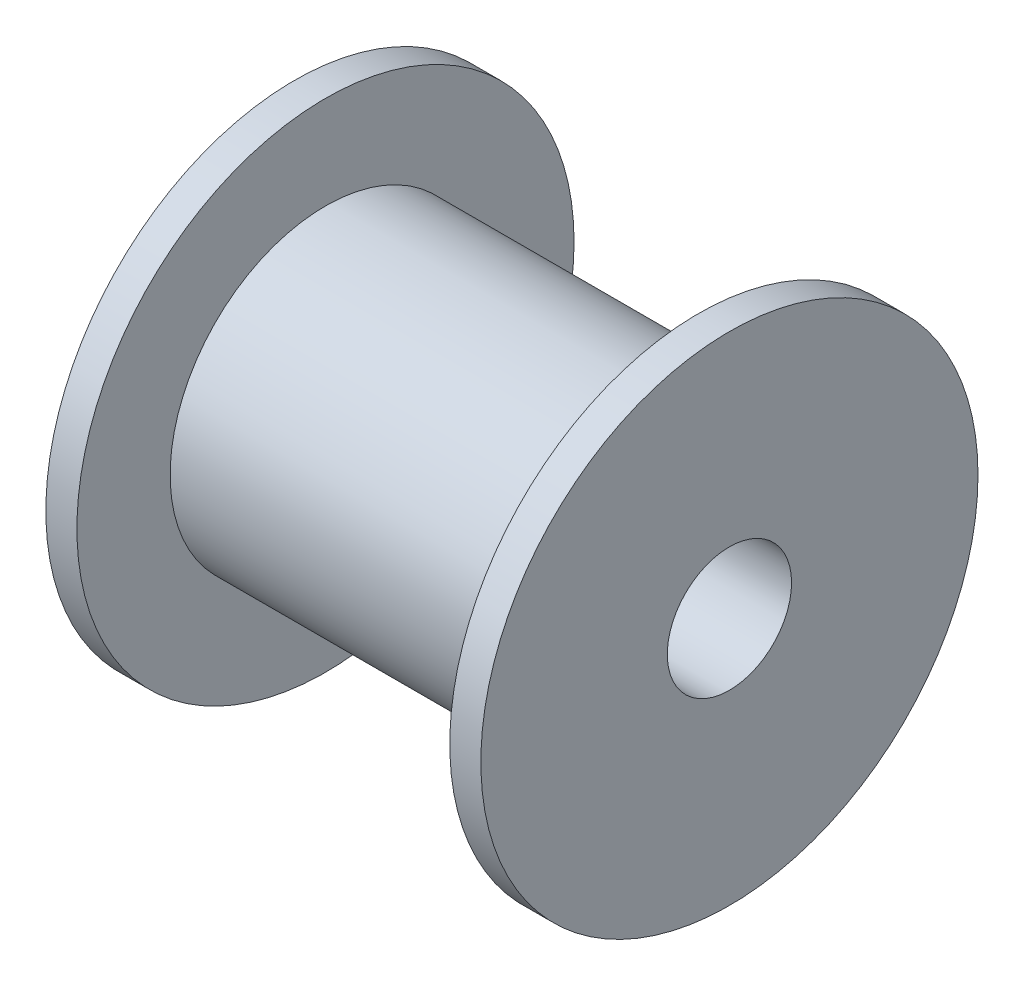
ISO-10303-21;
HEADER;
FILE_DESCRIPTION(('STEP AP214'),'2;1');
FILE_NAME('part.step','',(''),(''),'','','');
FILE_SCHEMA(('AUTOMOTIVE_DESIGN { 1 0 10303 214 1 1 1 1 }'));
ENDSEC;
DATA;
#1=APPLICATION_CONTEXT('core data for automotive mechanical design processes');
#2=APPLICATION_PROTOCOL_DEFINITION('international standard','automotive_design',2000,#1);
#3=PRODUCT_CONTEXT('',#1,'mechanical');
#4=PRODUCT('Part','Part','',(#3));
#5=PRODUCT_RELATED_PRODUCT_CATEGORY('part','',(#4));
#6=PRODUCT_DEFINITION_FORMATION('','',#4);
#7=PRODUCT_DEFINITION_CONTEXT('part definition',#1,'design');
#8=PRODUCT_DEFINITION('design','',#6,#7);
#9=PRODUCT_DEFINITION_SHAPE('','',#8);
#10=(LENGTH_UNIT() NAMED_UNIT(*) SI_UNIT(.MILLI.,.METRE.));
#11=(NAMED_UNIT(*) PLANE_ANGLE_UNIT() SI_UNIT($,.RADIAN.));
#12=(NAMED_UNIT(*) SI_UNIT($,.STERADIAN.) SOLID_ANGLE_UNIT());
#13=UNCERTAINTY_MEASURE_WITH_UNIT(LENGTH_MEASURE(1.E-05),#10,'distance_accuracy_value','');
#14=(GEOMETRIC_REPRESENTATION_CONTEXT(3) GLOBAL_UNCERTAINTY_ASSIGNED_CONTEXT((#13)) GLOBAL_UNIT_ASSIGNED_CONTEXT((#10,
#11,#12)) REPRESENTATION_CONTEXT('',''));
#15=CARTESIAN_POINT('',(0.,0.,0.));
#16=DIRECTION('',(0.,0.,1.));
#17=DIRECTION('',(1.,0.,0.));
#18=AXIS2_PLACEMENT_3D('',#15,#16,#17);
#19=CARTESIAN_POINT('',(15.,0.,0.));
#20=DIRECTION('',(-1.,0.,0.));
#21=DIRECTION('',(0.,0.,1.));
#22=AXIS2_PLACEMENT_3D('',#19,#20,#21);
#23=CYLINDRICAL_SURFACE('',#22,12.5);
#24=CARTESIAN_POINT('',(15.,0.,0.));
#25=DIRECTION('',(1.,0.,0.));
#26=DIRECTION('',(0.,0.,-1.));
#27=AXIS2_PLACEMENT_3D('',#24,#25,#26);
#28=CIRCLE('',#27,12.5);
#29=CARTESIAN_POINT('',(15.,0.,-12.5));
#30=VERTEX_POINT('',#29);
#31=EDGE_CURVE('E10',#30,#30,#28,.T.);
#32=ORIENTED_EDGE('',*,*,#31,.F.);
#33=EDGE_LOOP('',(#32));
#34=FACE_BOUND('',#33,.T.);
#35=CARTESIAN_POINT('',(-15.,0.,0.));
#36=DIRECTION('',(1.,0.,0.));
#37=DIRECTION('',(0.,0.,-1.));
#38=AXIS2_PLACEMENT_3D('',#35,#36,#37);
#39=CIRCLE('',#38,12.5);
#40=CARTESIAN_POINT('',(-15.,0.,-12.5));
#41=VERTEX_POINT('',#40);
#42=EDGE_CURVE('E41',#41,#41,#39,.T.);
#43=ORIENTED_EDGE('',*,*,#42,.T.);
#44=EDGE_LOOP('',(#43));
#45=FACE_BOUND('',#44,.T.);
#46=ADVANCED_FACE('F38',(#34,#45),#23,.T.);
#47=CARTESIAN_POINT('',(17.5,0.,0.));
#48=DIRECTION('',(-1.,0.,0.));
#49=DIRECTION('',(0.,0.,1.));
#50=AXIS2_PLACEMENT_3D('',#47,#48,#49);
#51=CYLINDRICAL_SURFACE('',#50,20.);
#52=CARTESIAN_POINT('',(17.5,0.,0.));
#53=DIRECTION('',(1.,0.,0.));
#54=DIRECTION('',(0.,0.,-1.));
#55=AXIS2_PLACEMENT_3D('',#52,#53,#54);
#56=CIRCLE('',#55,20.);
#57=CARTESIAN_POINT('',(17.5,0.,-20.));
#58=VERTEX_POINT('',#57);
#59=EDGE_CURVE('E45',#58,#58,#56,.T.);
#60=ORIENTED_EDGE('',*,*,#59,.F.);
#61=EDGE_LOOP('',(#60));
#62=FACE_BOUND('',#61,.T.);
#63=CARTESIAN_POINT('',(15.,0.,0.));
#64=DIRECTION('',(1.,0.,0.));
#65=DIRECTION('',(0.,0.,-1.));
#66=AXIS2_PLACEMENT_3D('',#63,#64,#65);
#67=CIRCLE('',#66,20.);
#68=CARTESIAN_POINT('',(15.,0.,-20.));
#69=VERTEX_POINT('',#68);
#70=EDGE_CURVE('E49',#69,#69,#67,.T.);
#71=ORIENTED_EDGE('',*,*,#70,.T.);
#72=EDGE_LOOP('',(#71));
#73=FACE_BOUND('',#72,.T.);
#74=ADVANCED_FACE('F81',(#62,#73),#51,.T.);
#75=CARTESIAN_POINT('',(17.5,0.,0.));
#76=DIRECTION('',(1.,0.,0.));
#77=DIRECTION('',(0.,0.,-1.));
#78=AXIS2_PLACEMENT_3D('',#75,#76,#77);
#79=PLANE('',#78);
#80=CARTESIAN_POINT('',(17.5,0.,0.));
#81=DIRECTION('',(1.,0.,0.));
#82=DIRECTION('',(0.,0.,-1.));
#83=AXIS2_PLACEMENT_3D('',#80,#81,#82);
#84=CIRCLE('',#83,5.);
#85=CARTESIAN_POINT('',(17.5,0.,-5.));
#86=VERTEX_POINT('',#85);
#87=EDGE_CURVE('E58',#86,#86,#84,.T.);
#88=ORIENTED_EDGE('',*,*,#87,.F.);
#89=EDGE_LOOP('',(#88));
#90=FACE_BOUND('',#89,.T.);
#91=ORIENTED_EDGE('',*,*,#59,.T.);
#92=EDGE_LOOP('',(#91));
#93=FACE_BOUND('',#92,.T.);
#94=ADVANCED_FACE('F86',(#90,#93),#79,.T.);
#95=CARTESIAN_POINT('',(15.,0.,0.));
#96=DIRECTION('',(1.,0.,0.));
#97=DIRECTION('',(0.,0.,-1.));
#98=AXIS2_PLACEMENT_3D('',#95,#96,#97);
#99=PLANE('',#98);
#100=ORIENTED_EDGE('',*,*,#31,.T.);
#101=EDGE_LOOP('',(#100));
#102=FACE_BOUND('',#101,.T.);
#103=ORIENTED_EDGE('',*,*,#70,.F.);
#104=EDGE_LOOP('',(#103));
#105=FACE_BOUND('',#104,.T.);
#106=ADVANCED_FACE('F96',(#102,#105),#99,.F.);
#107=CARTESIAN_POINT('',(-17.5,0.,0.));
#108=DIRECTION('',(1.,0.,0.));
#109=DIRECTION('',(0.,0.,-1.));
#110=AXIS2_PLACEMENT_3D('',#107,#108,#109);
#111=CYLINDRICAL_SURFACE('',#110,20.);
#112=CARTESIAN_POINT('',(-17.5,0.,0.));
#113=DIRECTION('',(1.,0.,0.));
#114=DIRECTION('',(0.,0.,-1.));
#115=AXIS2_PLACEMENT_3D('',#112,#113,#114);
#116=CIRCLE('',#115,20.);
#117=CARTESIAN_POINT('',(-17.5,0.,-20.));
#118=VERTEX_POINT('',#117);
#119=EDGE_CURVE('E57',#118,#118,#116,.T.);
#120=ORIENTED_EDGE('',*,*,#119,.T.);
#121=EDGE_LOOP('',(#120));
#122=FACE_BOUND('',#121,.T.);
#123=CARTESIAN_POINT('',(-15.,0.,0.));
#124=DIRECTION('',(1.,0.,0.));
#125=DIRECTION('',(0.,0.,-1.));
#126=AXIS2_PLACEMENT_3D('',#123,#124,#125);
#127=CIRCLE('',#126,20.);
#128=CARTESIAN_POINT('',(-15.,0.,-20.));
#129=VERTEX_POINT('',#128);
#130=EDGE_CURVE('E54',#129,#129,#127,.T.);
#131=ORIENTED_EDGE('',*,*,#130,.F.);
#132=EDGE_LOOP('',(#131));
#133=FACE_BOUND('',#132,.T.);
#134=ADVANCED_FACE('F94',(#122,#133),#111,.T.);
#135=CARTESIAN_POINT('',(-17.5,0.,0.));
#136=DIRECTION('',(-1.,0.,0.));
#137=DIRECTION('',(0.,0.,-1.));
#138=AXIS2_PLACEMENT_3D('',#135,#136,#137);
#139=PLANE('',#138);
#140=CARTESIAN_POINT('',(-17.5,0.,0.));
#141=DIRECTION('',(1.,0.,0.));
#142=DIRECTION('',(0.,0.,-1.));
#143=AXIS2_PLACEMENT_3D('',#140,#141,#142);
#144=CIRCLE('',#143,5.);
#145=CARTESIAN_POINT('',(-17.5,0.,-5.));
#146=VERTEX_POINT('',#145);
#147=EDGE_CURVE('E63',#146,#146,#144,.T.);
#148=ORIENTED_EDGE('',*,*,#147,.T.);
#149=EDGE_LOOP('',(#148));
#150=FACE_BOUND('',#149,.T.);
#151=ORIENTED_EDGE('',*,*,#119,.F.);
#152=EDGE_LOOP('',(#151));
#153=FACE_BOUND('',#152,.T.);
#154=ADVANCED_FACE('F67',(#150,#153),#139,.T.);
#155=CARTESIAN_POINT('',(-15.,0.,0.));
#156=DIRECTION('',(-1.,0.,0.));
#157=DIRECTION('',(0.,0.,-1.));
#158=AXIS2_PLACEMENT_3D('',#155,#156,#157);
#159=PLANE('',#158);
#160=ORIENTED_EDGE('',*,*,#42,.F.);
#161=EDGE_LOOP('',(#160));
#162=FACE_BOUND('',#161,.T.);
#163=ORIENTED_EDGE('',*,*,#130,.T.);
#164=EDGE_LOOP('',(#163));
#165=FACE_BOUND('',#164,.T.);
#166=ADVANCED_FACE('F72',(#162,#165),#159,.F.);
#167=CARTESIAN_POINT('',(15.,0.,0.));
#168=DIRECTION('',(-1.,0.,0.));
#169=DIRECTION('',(0.,0.,1.));
#170=AXIS2_PLACEMENT_3D('',#167,#168,#169);
#171=CYLINDRICAL_SURFACE('',#170,5.);
#172=ORIENTED_EDGE('',*,*,#87,.T.);
#173=EDGE_LOOP('',(#172));
#174=FACE_BOUND('',#173,.T.);
#175=ORIENTED_EDGE('',*,*,#147,.F.);
#176=EDGE_LOOP('',(#175));
#177=FACE_BOUND('',#176,.T.);
#178=ADVANCED_FACE('F70',(#174,#177),#171,.F.);
#179=CLOSED_SHELL('',(#46,#74,#94,#106,#134,#154,#166,#178));
#180=MANIFOLD_SOLID_BREP('B2',#179);
#181=ADVANCED_BREP_SHAPE_REPRESENTATION('',(#18,#180),#14);
#182=SHAPE_DEFINITION_REPRESENTATION(#9,#181);
ENDSEC;
END-ISO-10303-21;
